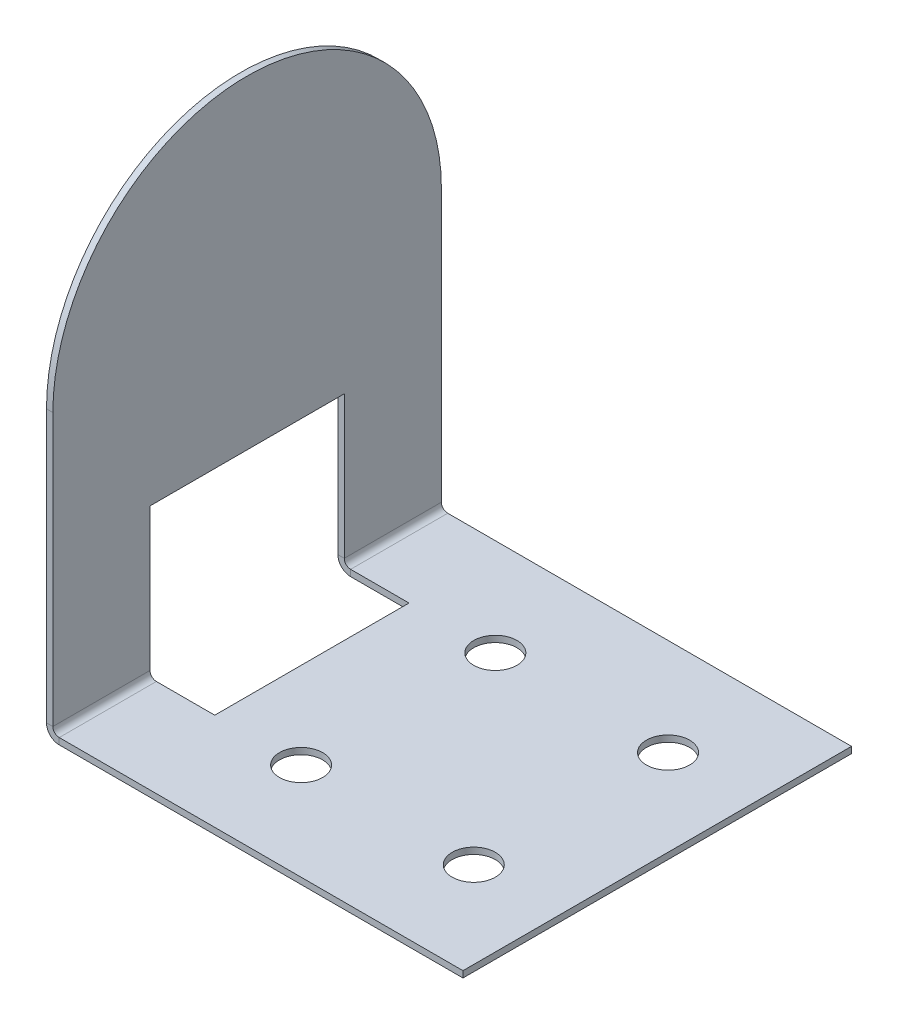
ISO-10303-21;
HEADER;
FILE_DESCRIPTION(('STEP AP214'),'2;1');
FILE_NAME('part.step','',(''),(''),'','','');
FILE_SCHEMA(('AUTOMOTIVE_DESIGN { 1 0 10303 214 1 1 1 1 }'));
ENDSEC;
DATA;
#1=APPLICATION_CONTEXT('core data for automotive mechanical design processes');
#2=APPLICATION_PROTOCOL_DEFINITION('international standard','automotive_design',2000,#1);
#3=PRODUCT_CONTEXT('',#1,'mechanical');
#4=PRODUCT('Part','Part','',(#3));
#5=PRODUCT_RELATED_PRODUCT_CATEGORY('part','',(#4));
#6=PRODUCT_DEFINITION_FORMATION('','',#4);
#7=PRODUCT_DEFINITION_CONTEXT('part definition',#1,'design');
#8=PRODUCT_DEFINITION('design','',#6,#7);
#9=PRODUCT_DEFINITION_SHAPE('','',#8);
#10=(LENGTH_UNIT() NAMED_UNIT(*) SI_UNIT(.MILLI.,.METRE.));
#11=(NAMED_UNIT(*) PLANE_ANGLE_UNIT() SI_UNIT($,.RADIAN.));
#12=(NAMED_UNIT(*) SI_UNIT($,.STERADIAN.) SOLID_ANGLE_UNIT());
#13=UNCERTAINTY_MEASURE_WITH_UNIT(LENGTH_MEASURE(1.E-05),#10,'distance_accuracy_value','');
#14=(GEOMETRIC_REPRESENTATION_CONTEXT(3) GLOBAL_UNCERTAINTY_ASSIGNED_CONTEXT((#13)) GLOBAL_UNIT_ASSIGNED_CONTEXT((#10,
#11,#12)) REPRESENTATION_CONTEXT('',''));
#15=CARTESIAN_POINT('',(0.,0.,0.));
#16=DIRECTION('',(0.,0.,1.));
#17=DIRECTION('',(1.,0.,0.));
#18=AXIS2_PLACEMENT_3D('',#15,#16,#17);
#19=CARTESIAN_POINT('',(-8.23659999999989,32.2376271385243,22.5));
#20=DIRECTION('',(0.,0.,1.));
#21=DIRECTION('',(0.,-1.,0.));
#22=AXIS2_PLACEMENT_3D('',#19,#20,#21);
#23=PLANE('',#22);
#24=DIRECTION('',(0.,-1.,0.));
#25=VECTOR('',#24,1.);
#26=CARTESIAN_POINT('',(-8.23659999999989,32.2376271385243,22.5));
#27=LINE('',#26,#25);
#28=CARTESIAN_POINT('',(-8.23659999999989,32.2376271385243,22.5));
#29=VERTEX_POINT('',#28);
#30=CARTESIAN_POINT('',(-8.2366,0.736600000000006,22.5));
#31=VERTEX_POINT('',#30);
#32=EDGE_CURVE('E199',#29,#31,#27,.T.);
#33=ORIENTED_EDGE('',*,*,#32,.T.);
#34=DIRECTION('',(1.,0.,0.));
#35=VECTOR('',#34,1.);
#36=CARTESIAN_POINT('',(-8.2366,0.736600000000006,22.5));
#37=LINE('',#36,#35);
#38=CARTESIAN_POINT('',(-7.49999999999999,0.736600000000009,22.5));
#39=VERTEX_POINT('',#38);
#40=EDGE_CURVE('E12',#31,#39,#37,.T.);
#41=ORIENTED_EDGE('',*,*,#40,.T.);
#42=DIRECTION('',(0.,-1.,0.));
#43=VECTOR('',#42,1.);
#44=CARTESIAN_POINT('',(-7.49999999999989,32.2376271385243,22.5));
#45=LINE('',#44,#43);
#46=CARTESIAN_POINT('',(-7.49999999999989,32.2376271385243,22.5));
#47=VERTEX_POINT('',#46);
#48=EDGE_CURVE('E194',#47,#39,#45,.T.);
#49=ORIENTED_EDGE('',*,*,#48,.F.);
#50=DIRECTION('',(1.,0.,0.));
#51=VECTOR('',#50,1.);
#52=CARTESIAN_POINT('',(-8.23659999999989,32.2376271385243,22.5));
#53=LINE('',#52,#51);
#54=EDGE_CURVE('E221',#29,#47,#53,.T.);
#55=ORIENTED_EDGE('',*,*,#54,.F.);
#56=EDGE_LOOP('',(#33,#41,#49,#55));
#57=FACE_BOUND('',#56,.T.);
#58=ADVANCED_FACE('F38',(#57),#23,.T.);
#59=CARTESIAN_POINT('',(-8.23659999999989,32.2376271385243,-22.5));
#60=DIRECTION('',(0.,0.,-1.));
#61=DIRECTION('',(0.,1.,0.));
#62=AXIS2_PLACEMENT_3D('',#59,#60,#61);
#63=PLANE('',#62);
#64=DIRECTION('',(0.,1.,0.));
#65=VECTOR('',#64,1.);
#66=CARTESIAN_POINT('',(-7.49999999999989,32.2376271385243,-22.5));
#67=LINE('',#66,#65);
#68=CARTESIAN_POINT('',(-7.5,0.736600000000009,-22.5));
#69=VERTEX_POINT('',#68);
#70=CARTESIAN_POINT('',(-7.49999999999989,32.2376271385243,-22.5));
#71=VERTEX_POINT('',#70);
#72=EDGE_CURVE('E206',#69,#71,#67,.T.);
#73=ORIENTED_EDGE('',*,*,#72,.F.);
#74=DIRECTION('',(-1.,0.,0.));
#75=VECTOR('',#74,1.);
#76=CARTESIAN_POINT('',(-8.2366,0.736600000000006,-22.5));
#77=LINE('',#76,#75);
#78=CARTESIAN_POINT('',(-8.2366,0.736600000000018,-22.5));
#79=VERTEX_POINT('',#78);
#80=EDGE_CURVE('E227',#69,#79,#77,.T.);
#81=ORIENTED_EDGE('',*,*,#80,.T.);
#82=DIRECTION('',(0.,1.,0.));
#83=VECTOR('',#82,1.);
#84=CARTESIAN_POINT('',(-8.23659999999989,32.2376271385243,-22.5));
#85=LINE('',#84,#83);
#86=CARTESIAN_POINT('',(-8.23659999999989,32.2376271385243,-22.5));
#87=VERTEX_POINT('',#86);
#88=EDGE_CURVE('E197',#79,#87,#85,.T.);
#89=ORIENTED_EDGE('',*,*,#88,.T.);
#90=DIRECTION('',(1.,0.,0.));
#91=VECTOR('',#90,1.);
#92=CARTESIAN_POINT('',(-8.23659999999989,32.2376271385243,-22.5));
#93=LINE('',#92,#91);
#94=EDGE_CURVE('E200',#87,#71,#93,.T.);
#95=ORIENTED_EDGE('',*,*,#94,.T.);
#96=EDGE_LOOP('',(#73,#81,#89,#95));
#97=FACE_BOUND('',#96,.T.);
#98=ADVANCED_FACE('F404',(#97),#63,.T.);
#99=CARTESIAN_POINT('',(-8.23659999999989,32.2376271385243,0.));
#100=DIRECTION('',(-1.,0.,0.));
#101=DIRECTION('',(0.,0.,-1.));
#102=AXIS2_PLACEMENT_3D('',#99,#100,#101);
#103=PLANE('',#102);
#104=ORIENTED_EDGE('',*,*,#88,.F.);
#105=DIRECTION('',(0.,0.,1.));
#106=VECTOR('',#105,1.);
#107=CARTESIAN_POINT('',(-8.2366,0.736600000000002,0.));
#108=LINE('',#107,#106);
#109=CARTESIAN_POINT('',(-8.2366,0.736600000000004,-11.25));
#110=VERTEX_POINT('',#109);
#111=EDGE_CURVE('E223',#79,#110,#108,.T.);
#112=ORIENTED_EDGE('',*,*,#111,.T.);
#113=DIRECTION('',(0.,1.,0.));
#114=VECTOR('',#113,1.);
#115=CARTESIAN_POINT('',(-8.23660000000003,-7.76237286147568,-11.25));
#116=LINE('',#115,#114);
#117=CARTESIAN_POINT('',(-8.23659999999994,17.2376271385243,-11.25));
#118=VERTEX_POINT('',#117);
#119=EDGE_CURVE('E42',#110,#118,#116,.T.);
#120=ORIENTED_EDGE('',*,*,#119,.T.);
#121=DIRECTION('',(0.,0.,1.));
#122=VECTOR('',#121,1.);
#123=CARTESIAN_POINT('',(-8.23659999999994,17.2376271385243,11.25));
#124=LINE('',#123,#122);
#125=CARTESIAN_POINT('',(-8.23659999999994,17.2376271385243,11.25));
#126=VERTEX_POINT('',#125);
#127=EDGE_CURVE('E179',#118,#126,#124,.T.);
#128=ORIENTED_EDGE('',*,*,#127,.T.);
#129=DIRECTION('',(0.,-1.,0.));
#130=VECTOR('',#129,1.);
#131=CARTESIAN_POINT('',(-8.23660000000003,-7.76237286147568,11.25));
#132=LINE('',#131,#130);
#133=CARTESIAN_POINT('',(-8.23659999999999,0.736600000000015,11.25));
#134=VERTEX_POINT('',#133);
#135=EDGE_CURVE('E175',#126,#134,#132,.T.);
#136=ORIENTED_EDGE('',*,*,#135,.T.);
#137=DIRECTION('',(0.,0.,1.));
#138=VECTOR('',#137,1.);
#139=CARTESIAN_POINT('',(-8.2366,0.736600000000002,0.));
#140=LINE('',#139,#138);
#141=EDGE_CURVE('E153',#134,#31,#140,.T.);
#142=ORIENTED_EDGE('',*,*,#141,.T.);
#143=ORIENTED_EDGE('',*,*,#32,.F.);
#144=CARTESIAN_POINT('',(-8.23659999999989,32.2376271385243,0.));
#145=DIRECTION('',(1.,0.,0.));
#146=DIRECTION('',(0.,0.,-1.));
#147=AXIS2_PLACEMENT_3D('',#144,#145,#146);
#148=CIRCLE('',#147,22.5);
#149=EDGE_CURVE('E201',#87,#29,#148,.T.);
#150=ORIENTED_EDGE('',*,*,#149,.F.);
#151=EDGE_LOOP('',(#104,#112,#120,#128,#136,#142,#143,#150));
#152=FACE_BOUND('',#151,.T.);
#153=ADVANCED_FACE('F177',(#152),#103,.T.);
#154=CARTESIAN_POINT('',(-8.23659999999989,32.2376271385243,0.));
#155=DIRECTION('',(1.,0.,0.));
#156=DIRECTION('',(0.,0.,1.));
#157=AXIS2_PLACEMENT_3D('',#154,#155,#156);
#158=CYLINDRICAL_SURFACE('',#157,22.5);
#159=CARTESIAN_POINT('',(-7.49999999999989,32.2376271385243,0.));
#160=DIRECTION('',(1.,0.,0.));
#161=DIRECTION('',(0.,0.,-1.));
#162=AXIS2_PLACEMENT_3D('',#159,#160,#161);
#163=CIRCLE('',#162,22.5);
#164=EDGE_CURVE('E198',#71,#47,#163,.T.);
#165=ORIENTED_EDGE('',*,*,#164,.F.);
#166=ORIENTED_EDGE('',*,*,#94,.F.);
#167=ORIENTED_EDGE('',*,*,#149,.T.);
#168=ORIENTED_EDGE('',*,*,#54,.T.);
#169=EDGE_LOOP('',(#165,#166,#167,#168));
#170=FACE_BOUND('',#169,.T.);
#171=ADVANCED_FACE('F413',(#170),#158,.T.);
#172=CARTESIAN_POINT('',(-7.49999999999989,32.2376271385243,0.));
#173=DIRECTION('',(-1.,0.,0.));
#174=DIRECTION('',(0.,0.,-1.));
#175=AXIS2_PLACEMENT_3D('',#172,#173,#174);
#176=PLANE('',#175);
#177=DIRECTION('',(0.,0.,1.));
#178=VECTOR('',#177,1.);
#179=CARTESIAN_POINT('',(-7.5,0.7366,0.));
#180=LINE('',#179,#178);
#181=CARTESIAN_POINT('',(-7.5,0.736600000000007,-11.25));
#182=VERTEX_POINT('',#181);
#183=EDGE_CURVE('E229',#69,#182,#180,.T.);
#184=ORIENTED_EDGE('',*,*,#183,.F.);
#185=ORIENTED_EDGE('',*,*,#72,.T.);
#186=ORIENTED_EDGE('',*,*,#164,.T.);
#187=ORIENTED_EDGE('',*,*,#48,.T.);
#188=DIRECTION('',(0.,0.,1.));
#189=VECTOR('',#188,1.);
#190=CARTESIAN_POINT('',(-7.5,0.7366,0.));
#191=LINE('',#190,#189);
#192=CARTESIAN_POINT('',(-7.49999999999999,0.736600000000007,11.25));
#193=VERTEX_POINT('',#192);
#194=EDGE_CURVE('E47',#193,#39,#191,.T.);
#195=ORIENTED_EDGE('',*,*,#194,.F.);
#196=DIRECTION('',(0.,-1.,0.));
#197=VECTOR('',#196,1.);
#198=CARTESIAN_POINT('',(-7.50000000000003,-7.76237286147568,11.25));
#199=LINE('',#198,#197);
#200=CARTESIAN_POINT('',(-7.49999999999994,17.2376271385243,11.25));
#201=VERTEX_POINT('',#200);
#202=EDGE_CURVE('E186',#201,#193,#199,.T.);
#203=ORIENTED_EDGE('',*,*,#202,.F.);
#204=DIRECTION('',(0.,0.,1.));
#205=VECTOR('',#204,1.);
#206=CARTESIAN_POINT('',(-7.49999999999994,17.2376271385243,11.25));
#207=LINE('',#206,#205);
#208=CARTESIAN_POINT('',(-7.49999999999994,17.2376271385243,-11.25));
#209=VERTEX_POINT('',#208);
#210=EDGE_CURVE('E193',#209,#201,#207,.T.);
#211=ORIENTED_EDGE('',*,*,#210,.F.);
#212=DIRECTION('',(0.,1.,0.));
#213=VECTOR('',#212,1.);
#214=CARTESIAN_POINT('',(-7.50000000000003,-7.76237286147568,-11.25));
#215=LINE('',#214,#213);
#216=EDGE_CURVE('E203',#182,#209,#215,.T.);
#217=ORIENTED_EDGE('',*,*,#216,.F.);
#218=EDGE_LOOP('',(#184,#185,#186,#187,#195,#203,#211,#217));
#219=FACE_BOUND('',#218,.T.);
#220=ADVANCED_FACE('F255',(#219),#176,.F.);
#221=CARTESIAN_POINT('',(-8.23660000000003,-7.76237286147568,11.25));
#222=DIRECTION('',(0.,0.,1.));
#223=DIRECTION('',(0.,-1.,0.));
#224=AXIS2_PLACEMENT_3D('',#221,#222,#223);
#225=PLANE('',#224);
#226=DIRECTION('',(1.,0.,0.));
#227=VECTOR('',#226,1.);
#228=CARTESIAN_POINT('',(-8.2366,0.736600000000004,11.25));
#229=LINE('',#228,#227);
#230=EDGE_CURVE('E162',#134,#193,#229,.T.);
#231=ORIENTED_EDGE('',*,*,#230,.F.);
#232=ORIENTED_EDGE('',*,*,#135,.F.);
#233=DIRECTION('',(1.,0.,0.));
#234=VECTOR('',#233,1.);
#235=CARTESIAN_POINT('',(-8.23659999999994,17.2376271385243,11.25));
#236=LINE('',#235,#234);
#237=EDGE_CURVE('E207',#126,#201,#236,.T.);
#238=ORIENTED_EDGE('',*,*,#237,.T.);
#239=ORIENTED_EDGE('',*,*,#202,.T.);
#240=EDGE_LOOP('',(#231,#232,#238,#239));
#241=FACE_BOUND('',#240,.T.);
#242=ADVANCED_FACE('F184',(#241),#225,.F.);
#243=CARTESIAN_POINT('',(-8.23659999999994,17.2376271385243,11.25));
#244=DIRECTION('',(0.,1.,0.));
#245=DIRECTION('',(0.,0.,1.));
#246=AXIS2_PLACEMENT_3D('',#243,#244,#245);
#247=PLANE('',#246);
#248=ORIENTED_EDGE('',*,*,#210,.T.);
#249=ORIENTED_EDGE('',*,*,#237,.F.);
#250=ORIENTED_EDGE('',*,*,#127,.F.);
#251=DIRECTION('',(1.,0.,0.));
#252=VECTOR('',#251,1.);
#253=CARTESIAN_POINT('',(-8.23659999999994,17.2376271385243,-11.25));
#254=LINE('',#253,#252);
#255=EDGE_CURVE('E181',#118,#209,#254,.T.);
#256=ORIENTED_EDGE('',*,*,#255,.T.);
#257=EDGE_LOOP('',(#248,#249,#250,#256));
#258=FACE_BOUND('',#257,.T.);
#259=ADVANCED_FACE('F252',(#258),#247,.F.);
#260=CARTESIAN_POINT('',(-8.23660000000003,-7.76237286147568,-11.25));
#261=DIRECTION('',(0.,0.,-1.));
#262=DIRECTION('',(0.,1.,0.));
#263=AXIS2_PLACEMENT_3D('',#260,#261,#262);
#264=PLANE('',#263);
#265=DIRECTION('',(-1.,0.,0.));
#266=VECTOR('',#265,1.);
#267=CARTESIAN_POINT('',(-8.2366,0.736600000000004,-11.25));
#268=LINE('',#267,#266);
#269=EDGE_CURVE('E163',#182,#110,#268,.T.);
#270=ORIENTED_EDGE('',*,*,#269,.F.);
#271=ORIENTED_EDGE('',*,*,#216,.T.);
#272=ORIENTED_EDGE('',*,*,#255,.F.);
#273=ORIENTED_EDGE('',*,*,#119,.F.);
#274=EDGE_LOOP('',(#270,#271,#272,#273));
#275=FACE_BOUND('',#274,.T.);
#276=ADVANCED_FACE('F40',(#275),#264,.F.);
#277=CARTESIAN_POINT('',(10.,-0.7366,11.25));
#278=DIRECTION('',(0.,1.,0.));
#279=DIRECTION('',(0.,0.,1.));
#280=AXIS2_PLACEMENT_3D('',#277,#278,#279);
#281=CYLINDRICAL_SURFACE('',#280,2.5);
#282=CARTESIAN_POINT('',(10.,-0.7366,11.25));
#283=DIRECTION('',(0.,1.,0.));
#284=DIRECTION('',(0.,0.,1.));
#285=AXIS2_PLACEMENT_3D('',#282,#283,#284);
#286=CIRCLE('',#285,2.5);
#287=CARTESIAN_POINT('',(10.,-0.7366,13.75));
#288=VERTEX_POINT('',#287);
#289=EDGE_CURVE('E309',#288,#288,#286,.T.);
#290=ORIENTED_EDGE('',*,*,#289,.F.);
#291=EDGE_LOOP('',(#290));
#292=FACE_BOUND('',#291,.T.);
#293=CARTESIAN_POINT('',(10.,0.,11.25));
#294=DIRECTION('',(0.,1.,0.));
#295=DIRECTION('',(0.,0.,1.));
#296=AXIS2_PLACEMENT_3D('',#293,#294,#295);
#297=CIRCLE('',#296,2.5);
#298=CARTESIAN_POINT('',(10.,0.,13.75));
#299=VERTEX_POINT('',#298);
#300=EDGE_CURVE('E347',#299,#299,#297,.T.);
#301=ORIENTED_EDGE('',*,*,#300,.T.);
#302=EDGE_LOOP('',(#301));
#303=FACE_BOUND('',#302,.T.);
#304=ADVANCED_FACE('F447',(#292,#303),#281,.F.);
#305=CARTESIAN_POINT('',(10.,-0.7366,-11.25));
#306=DIRECTION('',(0.,1.,0.));
#307=DIRECTION('',(0.,0.,1.));
#308=AXIS2_PLACEMENT_3D('',#305,#306,#307);
#309=CYLINDRICAL_SURFACE('',#308,2.5);
#310=CARTESIAN_POINT('',(10.,-0.7366,-11.25));
#311=DIRECTION('',(0.,1.,0.));
#312=DIRECTION('',(0.,0.,1.));
#313=AXIS2_PLACEMENT_3D('',#310,#311,#312);
#314=CIRCLE('',#313,2.5);
#315=CARTESIAN_POINT('',(10.,-0.7366,-8.75));
#316=VERTEX_POINT('',#315);
#317=EDGE_CURVE('E312',#316,#316,#314,.T.);
#318=ORIENTED_EDGE('',*,*,#317,.F.);
#319=EDGE_LOOP('',(#318));
#320=FACE_BOUND('',#319,.T.);
#321=CARTESIAN_POINT('',(10.,0.,-11.25));
#322=DIRECTION('',(0.,1.,0.));
#323=DIRECTION('',(0.,0.,1.));
#324=AXIS2_PLACEMENT_3D('',#321,#322,#323);
#325=CIRCLE('',#324,2.5);
#326=CARTESIAN_POINT('',(10.,0.,-8.75));
#327=VERTEX_POINT('',#326);
#328=EDGE_CURVE('E344',#327,#327,#325,.T.);
#329=ORIENTED_EDGE('',*,*,#328,.T.);
#330=EDGE_LOOP('',(#329));
#331=FACE_BOUND('',#330,.T.);
#332=ADVANCED_FACE('F453',(#320,#331),#309,.F.);
#333=CARTESIAN_POINT('',(30.,-0.7366,11.25));
#334=DIRECTION('',(0.,1.,0.));
#335=DIRECTION('',(0.,0.,1.));
#336=AXIS2_PLACEMENT_3D('',#333,#334,#335);
#337=CYLINDRICAL_SURFACE('',#336,2.50000000000001);
#338=CARTESIAN_POINT('',(30.,-0.7366,11.25));
#339=DIRECTION('',(0.,1.,0.));
#340=DIRECTION('',(0.,0.,1.));
#341=AXIS2_PLACEMENT_3D('',#338,#339,#340);
#342=CIRCLE('',#341,2.50000000000001);
#343=CARTESIAN_POINT('',(30.,-0.7366,13.75));
#344=VERTEX_POINT('',#343);
#345=EDGE_CURVE('E315',#344,#344,#342,.T.);
#346=ORIENTED_EDGE('',*,*,#345,.F.);
#347=EDGE_LOOP('',(#346));
#348=FACE_BOUND('',#347,.T.);
#349=CARTESIAN_POINT('',(30.,0.,11.25));
#350=DIRECTION('',(0.,1.,0.));
#351=DIRECTION('',(0.,0.,1.));
#352=AXIS2_PLACEMENT_3D('',#349,#350,#351);
#353=CIRCLE('',#352,2.50000000000001);
#354=CARTESIAN_POINT('',(30.,0.,13.75));
#355=VERTEX_POINT('',#354);
#356=EDGE_CURVE('E341',#355,#355,#353,.T.);
#357=ORIENTED_EDGE('',*,*,#356,.T.);
#358=EDGE_LOOP('',(#357));
#359=FACE_BOUND('',#358,.T.);
#360=ADVANCED_FACE('F465',(#348,#359),#337,.F.);
#361=CARTESIAN_POINT('',(30.,-0.7366,-11.25));
#362=DIRECTION('',(0.,1.,0.));
#363=DIRECTION('',(0.,0.,1.));
#364=AXIS2_PLACEMENT_3D('',#361,#362,#363);
#365=CYLINDRICAL_SURFACE('',#364,2.5);
#366=CARTESIAN_POINT('',(30.,-0.7366,-11.25));
#367=DIRECTION('',(0.,1.,0.));
#368=DIRECTION('',(0.,0.,1.));
#369=AXIS2_PLACEMENT_3D('',#366,#367,#368);
#370=CIRCLE('',#369,2.5);
#371=CARTESIAN_POINT('',(30.,-0.7366,-8.75));
#372=VERTEX_POINT('',#371);
#373=EDGE_CURVE('E318',#372,#372,#370,.T.);
#374=ORIENTED_EDGE('',*,*,#373,.F.);
#375=EDGE_LOOP('',(#374));
#376=FACE_BOUND('',#375,.T.);
#377=CARTESIAN_POINT('',(30.,0.,-11.25));
#378=DIRECTION('',(0.,1.,0.));
#379=DIRECTION('',(0.,0.,1.));
#380=AXIS2_PLACEMENT_3D('',#377,#378,#379);
#381=CIRCLE('',#380,2.5);
#382=CARTESIAN_POINT('',(30.,0.,-8.75));
#383=VERTEX_POINT('',#382);
#384=EDGE_CURVE('E338',#383,#383,#381,.T.);
#385=ORIENTED_EDGE('',*,*,#384,.T.);
#386=EDGE_LOOP('',(#385));
#387=FACE_BOUND('',#386,.T.);
#388=ADVANCED_FACE('F401',(#376,#387),#365,.F.);
#389=CARTESIAN_POINT('',(0.,-0.7366,11.25));
#390=DIRECTION('',(1.,0.,0.));
#391=DIRECTION('',(0.,0.,-1.));
#392=AXIS2_PLACEMENT_3D('',#389,#390,#391);
#393=PLANE('',#392);
#394=DIRECTION('',(0.,0.,-1.));
#395=VECTOR('',#394,1.);
#396=CARTESIAN_POINT('',(0.,0.,11.25));
#397=LINE('',#396,#395);
#398=CARTESIAN_POINT('',(0.,0.,11.25));
#399=VERTEX_POINT('',#398);
#400=CARTESIAN_POINT('',(0.,0.,-11.25));
#401=VERTEX_POINT('',#400);
#402=EDGE_CURVE('E336',#399,#401,#397,.T.);
#403=ORIENTED_EDGE('',*,*,#402,.T.);
#404=DIRECTION('',(0.,1.,0.));
#405=VECTOR('',#404,1.);
#406=CARTESIAN_POINT('',(0.,-0.7366,-11.25));
#407=LINE('',#406,#405);
#408=CARTESIAN_POINT('',(0.,-0.7366,-11.25));
#409=VERTEX_POINT('',#408);
#410=EDGE_CURVE('E286',#409,#401,#407,.T.);
#411=ORIENTED_EDGE('',*,*,#410,.F.);
#412=DIRECTION('',(0.,0.,-1.));
#413=VECTOR('',#412,1.);
#414=CARTESIAN_POINT('',(0.,-0.7366,11.25));
#415=LINE('',#414,#413);
#416=CARTESIAN_POINT('',(0.,-0.7366,11.25));
#417=VERTEX_POINT('',#416);
#418=EDGE_CURVE('E323',#417,#409,#415,.T.);
#419=ORIENTED_EDGE('',*,*,#418,.F.);
#420=DIRECTION('',(0.,1.,0.));
#421=VECTOR('',#420,1.);
#422=CARTESIAN_POINT('',(0.,-0.7366,11.25));
#423=LINE('',#422,#421);
#424=EDGE_CURVE('E333',#417,#399,#423,.T.);
#425=ORIENTED_EDGE('',*,*,#424,.T.);
#426=EDGE_LOOP('',(#403,#411,#419,#425));
#427=FACE_BOUND('',#426,.T.);
#428=ADVANCED_FACE('F377',(#427),#393,.F.);
#429=CARTESIAN_POINT('',(40.,-0.7366,-22.5));
#430=DIRECTION('',(1.,0.,0.));
#431=DIRECTION('',(0.,0.,-1.));
#432=AXIS2_PLACEMENT_3D('',#429,#430,#431);
#433=PLANE('',#432);
#434=DIRECTION('',(0.,0.,-1.));
#435=VECTOR('',#434,1.);
#436=CARTESIAN_POINT('',(40.,0.,-22.5));
#437=LINE('',#436,#435);
#438=CARTESIAN_POINT('',(40.,0.,22.5));
#439=VERTEX_POINT('',#438);
#440=CARTESIAN_POINT('',(40.,0.,-22.5));
#441=VERTEX_POINT('',#440);
#442=EDGE_CURVE('E294',#439,#441,#437,.T.);
#443=ORIENTED_EDGE('',*,*,#442,.F.);
#444=DIRECTION('',(0.,1.,0.));
#445=VECTOR('',#444,1.);
#446=CARTESIAN_POINT('',(40.,-0.7366,22.5));
#447=LINE('',#446,#445);
#448=CARTESIAN_POINT('',(40.,-0.7366,22.5));
#449=VERTEX_POINT('',#448);
#450=EDGE_CURVE('E205',#449,#439,#447,.T.);
#451=ORIENTED_EDGE('',*,*,#450,.F.);
#452=DIRECTION('',(0.,0.,-1.));
#453=VECTOR('',#452,1.);
#454=CARTESIAN_POINT('',(40.,-0.7366,-22.5));
#455=LINE('',#454,#453);
#456=CARTESIAN_POINT('',(40.,-0.7366,-22.5));
#457=VERTEX_POINT('',#456);
#458=EDGE_CURVE('E330',#449,#457,#455,.T.);
#459=ORIENTED_EDGE('',*,*,#458,.T.);
#460=DIRECTION('',(0.,1.,0.));
#461=VECTOR('',#460,1.);
#462=CARTESIAN_POINT('',(40.,-0.7366,-22.5));
#463=LINE('',#462,#461);
#464=EDGE_CURVE('E328',#457,#441,#463,.T.);
#465=ORIENTED_EDGE('',*,*,#464,.T.);
#466=EDGE_LOOP('',(#443,#451,#459,#465));
#467=FACE_BOUND('',#466,.T.);
#468=ADVANCED_FACE('F393',(#467),#433,.T.);
#469=CARTESIAN_POINT('',(-40.,-0.7366,0.));
#470=DIRECTION('',(0.,-1.,0.));
#471=DIRECTION('',(0.,0.,-1.));
#472=AXIS2_PLACEMENT_3D('',#469,#470,#471);
#473=PLANE('',#472);
#474=DIRECTION('',(0.,0.,1.));
#475=VECTOR('',#474,1.);
#476=CARTESIAN_POINT('',(-6.7634,-0.7366,0.));
#477=LINE('',#476,#475);
#478=CARTESIAN_POINT('',(-6.76339999999999,-0.7366,-22.5));
#479=VERTEX_POINT('',#478);
#480=CARTESIAN_POINT('',(-6.7634,-0.7366,-11.25));
#481=VERTEX_POINT('',#480);
#482=EDGE_CURVE('E353',#479,#481,#477,.T.);
#483=ORIENTED_EDGE('',*,*,#482,.F.);
#484=DIRECTION('',(-1.,0.,0.));
#485=VECTOR('',#484,1.);
#486=CARTESIAN_POINT('',(-40.,-0.7366,-22.5));
#487=LINE('',#486,#485);
#488=EDGE_CURVE('E307',#457,#479,#487,.T.);
#489=ORIENTED_EDGE('',*,*,#488,.F.);
#490=ORIENTED_EDGE('',*,*,#458,.F.);
#491=DIRECTION('',(1.,0.,0.));
#492=VECTOR('',#491,1.);
#493=CARTESIAN_POINT('',(-40.,-0.7366,22.5));
#494=LINE('',#493,#492);
#495=CARTESIAN_POINT('',(-6.7634,-0.7366,22.5));
#496=VERTEX_POINT('',#495);
#497=EDGE_CURVE('E281',#496,#449,#494,.T.);
#498=ORIENTED_EDGE('',*,*,#497,.F.);
#499=DIRECTION('',(0.,0.,1.));
#500=VECTOR('',#499,1.);
#501=CARTESIAN_POINT('',(-6.7634,-0.7366,0.));
#502=LINE('',#501,#500);
#503=CARTESIAN_POINT('',(-6.7634,-0.7366,11.25));
#504=VERTEX_POINT('',#503);
#505=EDGE_CURVE('E247',#504,#496,#502,.T.);
#506=ORIENTED_EDGE('',*,*,#505,.F.);
#507=DIRECTION('',(1.,0.,0.));
#508=VECTOR('',#507,1.);
#509=CARTESIAN_POINT('',(0.,-0.7366,11.25));
#510=LINE('',#509,#508);
#511=EDGE_CURVE('E326',#504,#417,#510,.T.);
#512=ORIENTED_EDGE('',*,*,#511,.T.);
#513=ORIENTED_EDGE('',*,*,#418,.T.);
#514=DIRECTION('',(-1.,0.,0.));
#515=VECTOR('',#514,1.);
#516=CARTESIAN_POINT('',(0.,-0.7366,-11.25));
#517=LINE('',#516,#515);
#518=EDGE_CURVE('E321',#409,#481,#517,.T.);
#519=ORIENTED_EDGE('',*,*,#518,.T.);
#520=EDGE_LOOP('',(#483,#489,#490,#498,#506,#512,#513,#519));
#521=FACE_BOUND('',#520,.T.);
#522=ORIENTED_EDGE('',*,*,#373,.T.);
#523=EDGE_LOOP('',(#522));
#524=FACE_BOUND('',#523,.T.);
#525=ORIENTED_EDGE('',*,*,#345,.T.);
#526=EDGE_LOOP('',(#525));
#527=FACE_BOUND('',#526,.T.);
#528=ORIENTED_EDGE('',*,*,#317,.T.);
#529=EDGE_LOOP('',(#528));
#530=FACE_BOUND('',#529,.T.);
#531=ORIENTED_EDGE('',*,*,#289,.T.);
#532=EDGE_LOOP('',(#531));
#533=FACE_BOUND('',#532,.T.);
#534=ADVANCED_FACE('F359',(#521,#524,#527,#530,#533),#473,.T.);
#535=CARTESIAN_POINT('',(-40.,-0.7366,-22.5));
#536=DIRECTION('',(0.,0.,-1.));
#537=DIRECTION('',(-1.,0.,0.));
#538=AXIS2_PLACEMENT_3D('',#535,#536,#537);
#539=PLANE('',#538);
#540=DIRECTION('',(0.,-1.,0.));
#541=VECTOR('',#540,1.);
#542=CARTESIAN_POINT('',(-6.7634,-0.7366,-22.5));
#543=LINE('',#542,#541);
#544=CARTESIAN_POINT('',(-6.7634,0.,-22.5));
#545=VERTEX_POINT('',#544);
#546=EDGE_CURVE('E350',#545,#479,#543,.T.);
#547=ORIENTED_EDGE('',*,*,#546,.F.);
#548=DIRECTION('',(-1.,0.,0.));
#549=VECTOR('',#548,1.);
#550=CARTESIAN_POINT('',(-40.,0.,-22.5));
#551=LINE('',#550,#549);
#552=EDGE_CURVE('E305',#441,#545,#551,.T.);
#553=ORIENTED_EDGE('',*,*,#552,.F.);
#554=ORIENTED_EDGE('',*,*,#464,.F.);
#555=ORIENTED_EDGE('',*,*,#488,.T.);
#556=EDGE_LOOP('',(#547,#553,#554,#555));
#557=FACE_BOUND('',#556,.T.);
#558=ADVANCED_FACE('F388',(#557),#539,.T.);
#559=CARTESIAN_POINT('',(-40.,0.,0.));
#560=DIRECTION('',(0.,-1.,0.));
#561=DIRECTION('',(0.,0.,-1.));
#562=AXIS2_PLACEMENT_3D('',#559,#560,#561);
#563=PLANE('',#562);
#564=ORIENTED_EDGE('',*,*,#300,.F.);
#565=EDGE_LOOP('',(#564));
#566=FACE_BOUND('',#565,.T.);
#567=ORIENTED_EDGE('',*,*,#328,.F.);
#568=EDGE_LOOP('',(#567));
#569=FACE_BOUND('',#568,.T.);
#570=ORIENTED_EDGE('',*,*,#356,.F.);
#571=EDGE_LOOP('',(#570));
#572=FACE_BOUND('',#571,.T.);
#573=ORIENTED_EDGE('',*,*,#384,.F.);
#574=EDGE_LOOP('',(#573));
#575=FACE_BOUND('',#574,.T.);
#576=ORIENTED_EDGE('',*,*,#552,.T.);
#577=DIRECTION('',(0.,0.,1.));
#578=VECTOR('',#577,1.);
#579=CARTESIAN_POINT('',(-6.7634,0.,0.));
#580=LINE('',#579,#578);
#581=CARTESIAN_POINT('',(-6.7634,0.,-11.25));
#582=VERTEX_POINT('',#581);
#583=EDGE_CURVE('E302',#545,#582,#580,.T.);
#584=ORIENTED_EDGE('',*,*,#583,.T.);
#585=DIRECTION('',(-1.,0.,0.));
#586=VECTOR('',#585,1.);
#587=CARTESIAN_POINT('',(0.,0.,-11.25));
#588=LINE('',#587,#586);
#589=EDGE_CURVE('E292',#401,#582,#588,.T.);
#590=ORIENTED_EDGE('',*,*,#589,.F.);
#591=ORIENTED_EDGE('',*,*,#402,.F.);
#592=DIRECTION('',(1.,0.,0.));
#593=VECTOR('',#592,1.);
#594=CARTESIAN_POINT('',(0.,0.,11.25));
#595=LINE('',#594,#593);
#596=CARTESIAN_POINT('',(-6.7634,0.,11.25));
#597=VERTEX_POINT('',#596);
#598=EDGE_CURVE('E283',#597,#399,#595,.T.);
#599=ORIENTED_EDGE('',*,*,#598,.F.);
#600=DIRECTION('',(0.,0.,1.));
#601=VECTOR('',#600,1.);
#602=CARTESIAN_POINT('',(-6.7634,0.,0.));
#603=LINE('',#602,#601);
#604=CARTESIAN_POINT('',(-6.76339999999999,0.,22.5));
#605=VERTEX_POINT('',#604);
#606=EDGE_CURVE('E299',#597,#605,#603,.T.);
#607=ORIENTED_EDGE('',*,*,#606,.T.);
#608=DIRECTION('',(1.,0.,0.));
#609=VECTOR('',#608,1.);
#610=CARTESIAN_POINT('',(-40.,0.,22.5));
#611=LINE('',#610,#609);
#612=EDGE_CURVE('E297',#605,#439,#611,.T.);
#613=ORIENTED_EDGE('',*,*,#612,.T.);
#614=ORIENTED_EDGE('',*,*,#442,.T.);
#615=EDGE_LOOP('',(#576,#584,#590,#591,#599,#607,#613,#614));
#616=FACE_BOUND('',#615,.T.);
#617=ADVANCED_FACE('F368',(#566,#569,#572,#575,#616),#563,.F.);
#618=CARTESIAN_POINT('',(0.,-0.7366,-11.25));
#619=DIRECTION('',(0.,0.,-1.));
#620=DIRECTION('',(-1.,0.,0.));
#621=AXIS2_PLACEMENT_3D('',#618,#619,#620);
#622=PLANE('',#621);
#623=ORIENTED_EDGE('',*,*,#589,.T.);
#624=DIRECTION('',(0.,-1.,0.));
#625=VECTOR('',#624,1.);
#626=CARTESIAN_POINT('',(-6.7634,-0.7366,-11.25));
#627=LINE('',#626,#625);
#628=EDGE_CURVE('E289',#582,#481,#627,.T.);
#629=ORIENTED_EDGE('',*,*,#628,.T.);
#630=ORIENTED_EDGE('',*,*,#518,.F.);
#631=ORIENTED_EDGE('',*,*,#410,.T.);
#632=EDGE_LOOP('',(#623,#629,#630,#631));
#633=FACE_BOUND('',#632,.T.);
#634=ADVANCED_FACE('F379',(#633),#622,.F.);
#635=CARTESIAN_POINT('',(0.,-0.7366,11.25));
#636=DIRECTION('',(0.,0.,1.));
#637=DIRECTION('',(1.,0.,0.));
#638=AXIS2_PLACEMENT_3D('',#635,#636,#637);
#639=PLANE('',#638);
#640=ORIENTED_EDGE('',*,*,#511,.F.);
#641=DIRECTION('',(0.,1.,0.));
#642=VECTOR('',#641,1.);
#643=CARTESIAN_POINT('',(-6.7634,-0.7366,11.25));
#644=LINE('',#643,#642);
#645=EDGE_CURVE('E170',#504,#597,#644,.T.);
#646=ORIENTED_EDGE('',*,*,#645,.T.);
#647=ORIENTED_EDGE('',*,*,#598,.T.);
#648=ORIENTED_EDGE('',*,*,#424,.F.);
#649=EDGE_LOOP('',(#640,#646,#647,#648));
#650=FACE_BOUND('',#649,.T.);
#651=ADVANCED_FACE('F373',(#650),#639,.F.);
#652=CARTESIAN_POINT('',(-40.,-0.7366,22.5));
#653=DIRECTION('',(0.,0.,1.));
#654=DIRECTION('',(1.,0.,0.));
#655=AXIS2_PLACEMENT_3D('',#652,#653,#654);
#656=PLANE('',#655);
#657=DIRECTION('',(0.,1.,0.));
#658=VECTOR('',#657,1.);
#659=CARTESIAN_POINT('',(-6.7634,-0.7366,22.5));
#660=LINE('',#659,#658);
#661=EDGE_CURVE('E267',#496,#605,#660,.T.);
#662=ORIENTED_EDGE('',*,*,#661,.F.);
#663=ORIENTED_EDGE('',*,*,#497,.T.);
#664=ORIENTED_EDGE('',*,*,#450,.T.);
#665=ORIENTED_EDGE('',*,*,#612,.F.);
#666=EDGE_LOOP('',(#662,#663,#664,#665));
#667=FACE_BOUND('',#666,.T.);
#668=ADVANCED_FACE('F364',(#667),#656,.T.);
#669=CARTESIAN_POINT('',(-6.7634,0.7366,-22.5));
#670=DIRECTION('',(0.,0.,-1.));
#671=DIRECTION('',(-1.,0.,0.));
#672=AXIS2_PLACEMENT_3D('',#669,#670,#671);
#673=PLANE('',#672);
#674=ORIENTED_EDGE('',*,*,#80,.F.);
#675=CARTESIAN_POINT('',(-6.7634,0.7366,-22.5));
#676=DIRECTION('',(0.,0.,-1.));
#677=DIRECTION('',(-1.,0.,0.));
#678=AXIS2_PLACEMENT_3D('',#675,#676,#677);
#679=CIRCLE('',#678,0.7366);
#680=EDGE_CURVE('E275',#69,#545,#679,.F.);
#681=ORIENTED_EDGE('',*,*,#680,.T.);
#682=ORIENTED_EDGE('',*,*,#546,.T.);
#683=CARTESIAN_POINT('',(-6.7634,0.7366,-22.5));
#684=DIRECTION('',(0.,0.,1.));
#685=DIRECTION('',(-1.,0.,0.));
#686=AXIS2_PLACEMENT_3D('',#683,#684,#685);
#687=CIRCLE('',#686,1.4732);
#688=EDGE_CURVE('E272',#79,#479,#687,.T.);
#689=ORIENTED_EDGE('',*,*,#688,.F.);
#690=EDGE_LOOP('',(#674,#681,#682,#689));
#691=FACE_BOUND('',#690,.T.);
#692=ADVANCED_FACE('F383',(#691),#673,.T.);
#693=CARTESIAN_POINT('',(-6.7634,0.7366,-11.25));
#694=DIRECTION('',(0.,0.,1.));
#695=DIRECTION('',(1.,0.,0.));
#696=AXIS2_PLACEMENT_3D('',#693,#694,#695);
#697=PLANE('',#696);
#698=CARTESIAN_POINT('',(-6.7634,0.7366,-11.25));
#699=DIRECTION('',(0.,0.,-1.));
#700=DIRECTION('',(-1.,0.,0.));
#701=AXIS2_PLACEMENT_3D('',#698,#699,#700);
#702=CIRCLE('',#701,0.7366);
#703=EDGE_CURVE('E236',#582,#182,#702,.T.);
#704=ORIENTED_EDGE('',*,*,#703,.T.);
#705=ORIENTED_EDGE('',*,*,#269,.T.);
#706=CARTESIAN_POINT('',(-6.7634,0.7366,-11.25));
#707=DIRECTION('',(0.,0.,-1.));
#708=DIRECTION('',(-1.,0.,0.));
#709=AXIS2_PLACEMENT_3D('',#706,#707,#708);
#710=CIRCLE('',#709,1.4732);
#711=EDGE_CURVE('E63',#481,#110,#710,.T.);
#712=ORIENTED_EDGE('',*,*,#711,.F.);
#713=ORIENTED_EDGE('',*,*,#628,.F.);
#714=EDGE_LOOP('',(#704,#705,#712,#713));
#715=FACE_BOUND('',#714,.T.);
#716=ADVANCED_FACE('F233',(#715),#697,.T.);
#717=CARTESIAN_POINT('',(-6.7634,0.7366,-5.4681032827727));
#718=DIRECTION('',(0.,0.,-1.));
#719=DIRECTION('',(-1.,0.,0.));
#720=AXIS2_PLACEMENT_3D('',#717,#718,#719);
#721=CYLINDRICAL_SURFACE('',#720,1.4732);
#722=ORIENTED_EDGE('',*,*,#482,.T.);
#723=ORIENTED_EDGE('',*,*,#711,.T.);
#724=ORIENTED_EDGE('',*,*,#111,.F.);
#725=ORIENTED_EDGE('',*,*,#688,.T.);
#726=EDGE_LOOP('',(#722,#723,#724,#725));
#727=FACE_BOUND('',#726,.T.);
#728=ADVANCED_FACE('F380',(#727),#721,.T.);
#729=CARTESIAN_POINT('',(-6.7634,0.7366,-5.4681032827727));
#730=DIRECTION('',(0.,0.,-1.));
#731=DIRECTION('',(-1.,0.,0.));
#732=AXIS2_PLACEMENT_3D('',#729,#730,#731);
#733=CYLINDRICAL_SURFACE('',#732,0.7366);
#734=ORIENTED_EDGE('',*,*,#583,.F.);
#735=ORIENTED_EDGE('',*,*,#680,.F.);
#736=ORIENTED_EDGE('',*,*,#183,.T.);
#737=ORIENTED_EDGE('',*,*,#703,.F.);
#738=EDGE_LOOP('',(#734,#735,#736,#737));
#739=FACE_BOUND('',#738,.T.);
#740=ADVANCED_FACE('F390',(#739),#733,.F.);
#741=CARTESIAN_POINT('',(-6.76339999999999,0.7366,11.25));
#742=DIRECTION('',(0.,0.,-1.));
#743=DIRECTION('',(-1.,0.,0.));
#744=AXIS2_PLACEMENT_3D('',#741,#742,#743);
#745=PLANE('',#744);
#746=ORIENTED_EDGE('',*,*,#230,.T.);
#747=CARTESIAN_POINT('',(-6.76339999999999,0.7366,11.25));
#748=DIRECTION('',(0.,0.,-1.));
#749=DIRECTION('',(-1.,0.,0.));
#750=AXIS2_PLACEMENT_3D('',#747,#748,#749);
#751=CIRCLE('',#750,0.7366);
#752=EDGE_CURVE('E263',#193,#597,#751,.F.);
#753=ORIENTED_EDGE('',*,*,#752,.T.);
#754=ORIENTED_EDGE('',*,*,#645,.F.);
#755=CARTESIAN_POINT('',(-6.76339999999999,0.7366,11.25));
#756=DIRECTION('',(0.,0.,1.));
#757=DIRECTION('',(1.,0.,0.));
#758=AXIS2_PLACEMENT_3D('',#755,#756,#757);
#759=CIRCLE('',#758,1.4732);
#760=EDGE_CURVE('E156',#134,#504,#759,.T.);
#761=ORIENTED_EDGE('',*,*,#760,.F.);
#762=EDGE_LOOP('',(#746,#753,#754,#761));
#763=FACE_BOUND('',#762,.T.);
#764=ADVANCED_FACE('F166',(#763),#745,.T.);
#765=CARTESIAN_POINT('',(-6.76339999999999,0.7366,22.5));
#766=DIRECTION('',(0.,0.,1.));
#767=DIRECTION('',(1.,0.,0.));
#768=AXIS2_PLACEMENT_3D('',#765,#766,#767);
#769=PLANE('',#768);
#770=CARTESIAN_POINT('',(-6.76339999999999,0.7366,22.5));
#771=DIRECTION('',(0.,0.,-1.));
#772=DIRECTION('',(-1.,0.,0.));
#773=AXIS2_PLACEMENT_3D('',#770,#771,#772);
#774=CIRCLE('',#773,0.7366);
#775=EDGE_CURVE('E171',#605,#39,#774,.T.);
#776=ORIENTED_EDGE('',*,*,#775,.T.);
#777=ORIENTED_EDGE('',*,*,#40,.F.);
#778=CARTESIAN_POINT('',(-6.76339999999999,0.7366,22.5));
#779=DIRECTION('',(0.,0.,-1.));
#780=DIRECTION('',(1.,0.,0.));
#781=AXIS2_PLACEMENT_3D('',#778,#779,#780);
#782=CIRCLE('',#781,1.4732);
#783=EDGE_CURVE('E55',#496,#31,#782,.T.);
#784=ORIENTED_EDGE('',*,*,#783,.F.);
#785=ORIENTED_EDGE('',*,*,#661,.T.);
#786=EDGE_LOOP('',(#776,#777,#784,#785));
#787=FACE_BOUND('',#786,.T.);
#788=ADVANCED_FACE('F265',(#787),#769,.T.);
#789=CARTESIAN_POINT('',(-6.76339999999999,0.7366,28.2818967172273));
#790=DIRECTION('',(0.,0.,-1.));
#791=DIRECTION('',(-1.,0.,0.));
#792=AXIS2_PLACEMENT_3D('',#789,#790,#791);
#793=CYLINDRICAL_SURFACE('',#792,1.4732);
#794=ORIENTED_EDGE('',*,*,#505,.T.);
#795=ORIENTED_EDGE('',*,*,#783,.T.);
#796=ORIENTED_EDGE('',*,*,#141,.F.);
#797=ORIENTED_EDGE('',*,*,#760,.T.);
#798=EDGE_LOOP('',(#794,#795,#796,#797));
#799=FACE_BOUND('',#798,.T.);
#800=ADVANCED_FACE('F155',(#799),#793,.T.);
#801=CARTESIAN_POINT('',(-6.76339999999999,0.7366,28.2818967172273));
#802=DIRECTION('',(0.,0.,-1.));
#803=DIRECTION('',(-1.,0.,0.));
#804=AXIS2_PLACEMENT_3D('',#801,#802,#803);
#805=CYLINDRICAL_SURFACE('',#804,0.7366);
#806=ORIENTED_EDGE('',*,*,#606,.F.);
#807=ORIENTED_EDGE('',*,*,#752,.F.);
#808=ORIENTED_EDGE('',*,*,#194,.T.);
#809=ORIENTED_EDGE('',*,*,#775,.F.);
#810=EDGE_LOOP('',(#806,#807,#808,#809));
#811=FACE_BOUND('',#810,.T.);
#812=ADVANCED_FACE('F261',(#811),#805,.F.);
#813=CLOSED_SHELL('',(#58,#98,#153,#171,#220,#242,#259,#276,#304,#332,#360,#388,#428,#468,#534,
#558,#617,#634,#651,#668,#692,#716,#728,#740,#764,#788,#800,#812));
#814=MANIFOLD_SOLID_BREP('B2',#813);
#815=ADVANCED_BREP_SHAPE_REPRESENTATION('',(#18,#814),#14);
#816=SHAPE_DEFINITION_REPRESENTATION(#9,#815);
ENDSEC;
END-ISO-10303-21;
